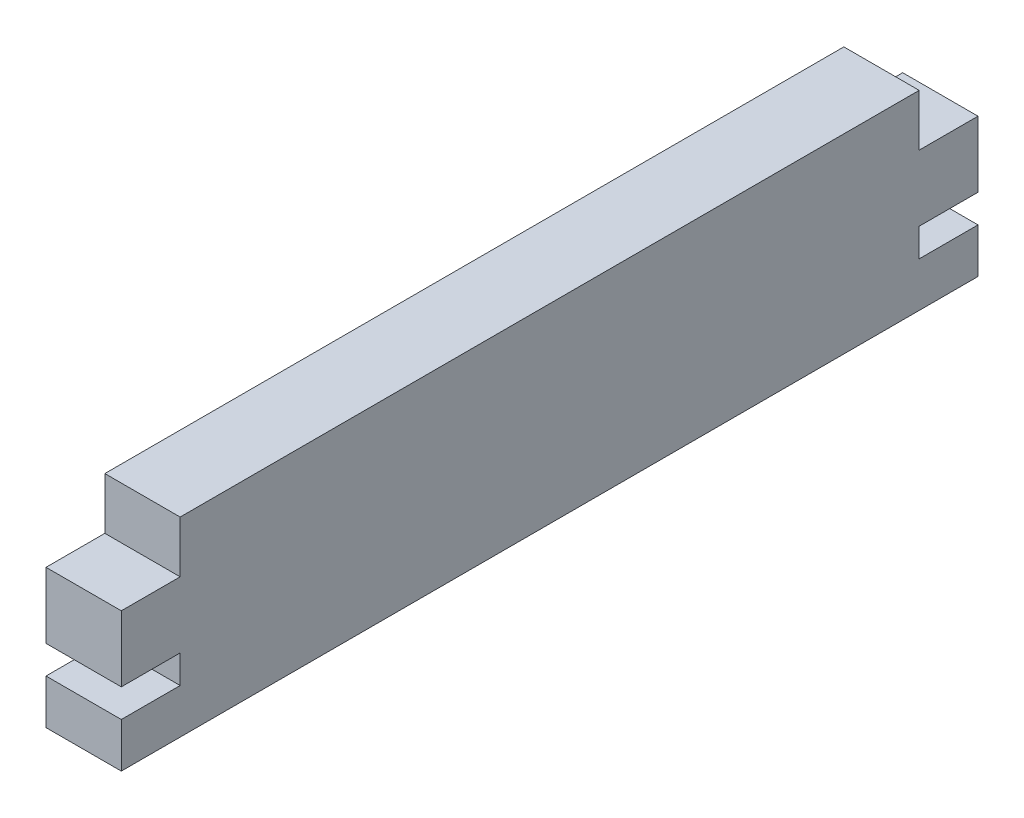
ISO-10303-21;
HEADER;
FILE_DESCRIPTION(('STEP AP214'),'2;1');
FILE_NAME('part.step','',(''),(''),'','','');
FILE_SCHEMA(('AUTOMOTIVE_DESIGN { 1 0 10303 214 1 1 1 1 }'));
ENDSEC;
DATA;
#1=APPLICATION_CONTEXT('core data for automotive mechanical design processes');
#2=APPLICATION_PROTOCOL_DEFINITION('international standard','automotive_design',2000,#1);
#3=PRODUCT_CONTEXT('',#1,'mechanical');
#4=PRODUCT('Part','Part','',(#3));
#5=PRODUCT_RELATED_PRODUCT_CATEGORY('part','',(#4));
#6=PRODUCT_DEFINITION_FORMATION('','',#4);
#7=PRODUCT_DEFINITION_CONTEXT('part definition',#1,'design');
#8=PRODUCT_DEFINITION('design','',#6,#7);
#9=PRODUCT_DEFINITION_SHAPE('','',#8);
#10=(LENGTH_UNIT() NAMED_UNIT(*) SI_UNIT(.MILLI.,.METRE.));
#11=(NAMED_UNIT(*) PLANE_ANGLE_UNIT() SI_UNIT($,.RADIAN.));
#12=(NAMED_UNIT(*) SI_UNIT($,.STERADIAN.) SOLID_ANGLE_UNIT());
#13=UNCERTAINTY_MEASURE_WITH_UNIT(LENGTH_MEASURE(1.E-05),#10,'distance_accuracy_value','');
#14=(GEOMETRIC_REPRESENTATION_CONTEXT(3) GLOBAL_UNCERTAINTY_ASSIGNED_CONTEXT((#13)) GLOBAL_UNIT_ASSIGNED_CONTEXT((#10,
#11,#12)) REPRESENTATION_CONTEXT('',''));
#15=CARTESIAN_POINT('',(0.,0.,0.));
#16=DIRECTION('',(0.,0.,1.));
#17=DIRECTION('',(1.,0.,0.));
#18=AXIS2_PLACEMENT_3D('',#15,#16,#17);
#19=CARTESIAN_POINT('',(4.064,10.287,0.));
#20=DIRECTION('',(0.,1.,0.));
#21=DIRECTION('',(0.,0.,1.));
#22=AXIS2_PLACEMENT_3D('',#19,#20,#21);
#23=PLANE('',#22);
#24=DIRECTION('',(0.,0.,-1.));
#25=VECTOR('',#24,1.);
#26=CARTESIAN_POINT('',(0.,10.287,0.));
#27=LINE('',#26,#25);
#28=CARTESIAN_POINT('',(0.,10.287,9.58569220054957));
#29=VERTEX_POINT('',#28);
#30=CARTESIAN_POINT('',(0.,10.287,-30.2923077994504));
#31=VERTEX_POINT('',#30);
#32=EDGE_CURVE('E183',#29,#31,#27,.T.);
#33=ORIENTED_EDGE('',*,*,#32,.F.);
#34=DIRECTION('',(-1.,0.,0.));
#35=VECTOR('',#34,1.);
#36=CARTESIAN_POINT('',(4.064,10.287,9.58569220054957));
#37=LINE('',#36,#35);
#38=CARTESIAN_POINT('',(4.064,10.287,9.58569220054957));
#39=VERTEX_POINT('',#38);
#40=EDGE_CURVE('E11',#39,#29,#37,.T.);
#41=ORIENTED_EDGE('',*,*,#40,.F.);
#42=DIRECTION('',(0.,0.,-1.));
#43=VECTOR('',#42,1.);
#44=CARTESIAN_POINT('',(4.064,10.287,0.));
#45=LINE('',#44,#43);
#46=CARTESIAN_POINT('',(4.064,10.287,-30.2923077994504));
#47=VERTEX_POINT('',#46);
#48=EDGE_CURVE('E221',#39,#47,#45,.T.);
#49=ORIENTED_EDGE('',*,*,#48,.T.);
#50=DIRECTION('',(-1.,0.,0.));
#51=VECTOR('',#50,1.);
#52=CARTESIAN_POINT('',(4.064,10.287,-30.2923077994504));
#53=LINE('',#52,#51);
#54=EDGE_CURVE('E55',#47,#31,#53,.T.);
#55=ORIENTED_EDGE('',*,*,#54,.T.);
#56=EDGE_LOOP('',(#33,#41,#49,#55));
#57=FACE_BOUND('',#56,.T.);
#58=ADVANCED_FACE('F39',(#57),#23,.T.);
#59=CARTESIAN_POINT('',(4.064,0.,9.58569220054957));
#60=DIRECTION('',(0.,0.,-1.));
#61=DIRECTION('',(-1.,0.,0.));
#62=AXIS2_PLACEMENT_3D('',#59,#60,#61);
#63=PLANE('',#62);
#64=DIRECTION('',(0.,-1.,0.));
#65=VECTOR('',#64,1.);
#66=CARTESIAN_POINT('',(0.,0.,9.58569220054957));
#67=LINE('',#66,#65);
#68=CARTESIAN_POINT('',(0.,7.493,9.58569220054957));
#69=VERTEX_POINT('',#68);
#70=EDGE_CURVE('E185',#29,#69,#67,.T.);
#71=ORIENTED_EDGE('',*,*,#70,.T.);
#72=DIRECTION('',(-1.,0.,0.));
#73=VECTOR('',#72,1.);
#74=CARTESIAN_POINT('',(4.064,7.493,9.58569220054957));
#75=LINE('',#74,#73);
#76=CARTESIAN_POINT('',(4.064,7.493,9.58569220054957));
#77=VERTEX_POINT('',#76);
#78=EDGE_CURVE('E47',#77,#69,#75,.T.);
#79=ORIENTED_EDGE('',*,*,#78,.F.);
#80=DIRECTION('',(0.,-1.,0.));
#81=VECTOR('',#80,1.);
#82=CARTESIAN_POINT('',(4.064,0.,9.58569220054957));
#83=LINE('',#82,#81);
#84=EDGE_CURVE('E268',#39,#77,#83,.T.);
#85=ORIENTED_EDGE('',*,*,#84,.F.);
#86=ORIENTED_EDGE('',*,*,#40,.T.);
#87=EDGE_LOOP('',(#71,#79,#85,#86));
#88=FACE_BOUND('',#87,.T.);
#89=ADVANCED_FACE('F256',(#88),#63,.F.);
#90=CARTESIAN_POINT('',(4.064,7.49300000000001,0.));
#91=DIRECTION('',(0.,1.,0.));
#92=DIRECTION('',(0.,0.,1.));
#93=AXIS2_PLACEMENT_3D('',#90,#91,#92);
#94=PLANE('',#93);
#95=DIRECTION('',(0.,0.,-1.));
#96=VECTOR('',#95,1.);
#97=CARTESIAN_POINT('',(0.,7.49300000000001,0.));
#98=LINE('',#97,#96);
#99=CARTESIAN_POINT('',(0.,7.493,12.7606922005496));
#100=VERTEX_POINT('',#99);
#101=EDGE_CURVE('E188',#100,#69,#98,.T.);
#102=ORIENTED_EDGE('',*,*,#101,.F.);
#103=DIRECTION('',(-1.,0.,0.));
#104=VECTOR('',#103,1.);
#105=CARTESIAN_POINT('',(4.064,7.493,12.7606922005496));
#106=LINE('',#105,#104);
#107=CARTESIAN_POINT('',(4.064,7.493,12.7606922005496));
#108=VERTEX_POINT('',#107);
#109=EDGE_CURVE('E246',#108,#100,#106,.T.);
#110=ORIENTED_EDGE('',*,*,#109,.F.);
#111=DIRECTION('',(0.,0.,-1.));
#112=VECTOR('',#111,1.);
#113=CARTESIAN_POINT('',(4.064,7.49300000000001,0.));
#114=LINE('',#113,#112);
#115=EDGE_CURVE('E253',#108,#77,#114,.T.);
#116=ORIENTED_EDGE('',*,*,#115,.T.);
#117=ORIENTED_EDGE('',*,*,#78,.T.);
#118=EDGE_LOOP('',(#102,#110,#116,#117));
#119=FACE_BOUND('',#118,.T.);
#120=ADVANCED_FACE('F251',(#119),#94,.T.);
#121=CARTESIAN_POINT('',(4.064,0.,12.7606922005496));
#122=DIRECTION('',(0.,0.,1.));
#123=DIRECTION('',(1.,0.,0.));
#124=AXIS2_PLACEMENT_3D('',#121,#122,#123);
#125=PLANE('',#124);
#126=DIRECTION('',(0.,1.,0.));
#127=VECTOR('',#126,1.);
#128=CARTESIAN_POINT('',(0.,0.,12.7606922005496));
#129=LINE('',#128,#127);
#130=CARTESIAN_POINT('',(0.,3.937,12.7606922005496));
#131=VERTEX_POINT('',#130);
#132=EDGE_CURVE('E191',#131,#100,#129,.T.);
#133=ORIENTED_EDGE('',*,*,#132,.F.);
#134=DIRECTION('',(-1.,0.,0.));
#135=VECTOR('',#134,1.);
#136=CARTESIAN_POINT('',(4.064,3.937,12.7606922005496));
#137=LINE('',#136,#135);
#138=CARTESIAN_POINT('',(4.064,3.937,12.7606922005496));
#139=VERTEX_POINT('',#138);
#140=EDGE_CURVE('E244',#139,#131,#137,.T.);
#141=ORIENTED_EDGE('',*,*,#140,.F.);
#142=DIRECTION('',(0.,1.,0.));
#143=VECTOR('',#142,1.);
#144=CARTESIAN_POINT('',(4.064,0.,12.7606922005496));
#145=LINE('',#144,#143);
#146=EDGE_CURVE('E267',#139,#108,#145,.T.);
#147=ORIENTED_EDGE('',*,*,#146,.T.);
#148=ORIENTED_EDGE('',*,*,#109,.T.);
#149=EDGE_LOOP('',(#133,#141,#147,#148));
#150=FACE_BOUND('',#149,.T.);
#151=ADVANCED_FACE('F263',(#150),#125,.T.);
#152=CARTESIAN_POINT('',(4.064,3.937,0.));
#153=DIRECTION('',(0.,1.,0.));
#154=DIRECTION('',(0.,0.,1.));
#155=AXIS2_PLACEMENT_3D('',#152,#153,#154);
#156=PLANE('',#155);
#157=DIRECTION('',(0.,0.,-1.));
#158=VECTOR('',#157,1.);
#159=CARTESIAN_POINT('',(0.,3.937,0.));
#160=LINE('',#159,#158);
#161=CARTESIAN_POINT('',(0.,3.937,9.58569220054957));
#162=VERTEX_POINT('',#161);
#163=EDGE_CURVE('E194',#131,#162,#160,.T.);
#164=ORIENTED_EDGE('',*,*,#163,.T.);
#165=DIRECTION('',(-1.,0.,0.));
#166=VECTOR('',#165,1.);
#167=CARTESIAN_POINT('',(4.064,3.937,9.58569220054957));
#168=LINE('',#167,#166);
#169=CARTESIAN_POINT('',(4.064,3.937,9.58569220054957));
#170=VERTEX_POINT('',#169);
#171=EDGE_CURVE('E241',#170,#162,#168,.T.);
#172=ORIENTED_EDGE('',*,*,#171,.F.);
#173=DIRECTION('',(0.,0.,-1.));
#174=VECTOR('',#173,1.);
#175=CARTESIAN_POINT('',(4.064,3.937,0.));
#176=LINE('',#175,#174);
#177=EDGE_CURVE('E270',#139,#170,#176,.T.);
#178=ORIENTED_EDGE('',*,*,#177,.F.);
#179=ORIENTED_EDGE('',*,*,#140,.T.);
#180=EDGE_LOOP('',(#164,#172,#178,#179));
#181=FACE_BOUND('',#180,.T.);
#182=ADVANCED_FACE('F311',(#181),#156,.F.);
#183=CARTESIAN_POINT('',(4.064,0.,9.58569220054957));
#184=DIRECTION('',(0.,0.,-1.));
#185=DIRECTION('',(-1.,0.,0.));
#186=AXIS2_PLACEMENT_3D('',#183,#184,#185);
#187=PLANE('',#186);
#188=DIRECTION('',(0.,-1.,0.));
#189=VECTOR('',#188,1.);
#190=CARTESIAN_POINT('',(0.,0.,9.58569220054957));
#191=LINE('',#190,#189);
#192=CARTESIAN_POINT('',(0.,2.413,9.58569220054957));
#193=VERTEX_POINT('',#192);
#194=EDGE_CURVE('E197',#162,#193,#191,.T.);
#195=ORIENTED_EDGE('',*,*,#194,.T.);
#196=DIRECTION('',(-1.,0.,0.));
#197=VECTOR('',#196,1.);
#198=CARTESIAN_POINT('',(4.064,2.413,9.58569220054957));
#199=LINE('',#198,#197);
#200=CARTESIAN_POINT('',(4.064,2.413,9.58569220054957));
#201=VERTEX_POINT('',#200);
#202=EDGE_CURVE('E239',#201,#193,#199,.T.);
#203=ORIENTED_EDGE('',*,*,#202,.F.);
#204=DIRECTION('',(0.,-1.,0.));
#205=VECTOR('',#204,1.);
#206=CARTESIAN_POINT('',(4.064,0.,9.58569220054957));
#207=LINE('',#206,#205);
#208=EDGE_CURVE('E277',#170,#201,#207,.T.);
#209=ORIENTED_EDGE('',*,*,#208,.F.);
#210=ORIENTED_EDGE('',*,*,#171,.T.);
#211=EDGE_LOOP('',(#195,#203,#209,#210));
#212=FACE_BOUND('',#211,.T.);
#213=ADVANCED_FACE('F314',(#212),#187,.F.);
#214=CARTESIAN_POINT('',(4.064,2.413,0.));
#215=DIRECTION('',(0.,1.,0.));
#216=DIRECTION('',(0.,0.,1.));
#217=AXIS2_PLACEMENT_3D('',#214,#215,#216);
#218=PLANE('',#217);
#219=DIRECTION('',(0.,0.,-1.));
#220=VECTOR('',#219,1.);
#221=CARTESIAN_POINT('',(0.,2.413,0.));
#222=LINE('',#221,#220);
#223=CARTESIAN_POINT('',(0.,2.413,12.7606922005496));
#224=VERTEX_POINT('',#223);
#225=EDGE_CURVE('E200',#224,#193,#222,.T.);
#226=ORIENTED_EDGE('',*,*,#225,.F.);
#227=DIRECTION('',(-1.,0.,0.));
#228=VECTOR('',#227,1.);
#229=CARTESIAN_POINT('',(4.064,2.413,12.7606922005496));
#230=LINE('',#229,#228);
#231=CARTESIAN_POINT('',(4.064,2.413,12.7606922005496));
#232=VERTEX_POINT('',#231);
#233=EDGE_CURVE('E237',#232,#224,#230,.T.);
#234=ORIENTED_EDGE('',*,*,#233,.F.);
#235=DIRECTION('',(0.,0.,-1.));
#236=VECTOR('',#235,1.);
#237=CARTESIAN_POINT('',(4.064,2.413,0.));
#238=LINE('',#237,#236);
#239=EDGE_CURVE('E279',#232,#201,#238,.T.);
#240=ORIENTED_EDGE('',*,*,#239,.T.);
#241=ORIENTED_EDGE('',*,*,#202,.T.);
#242=EDGE_LOOP('',(#226,#234,#240,#241));
#243=FACE_BOUND('',#242,.T.);
#244=ADVANCED_FACE('F318',(#243),#218,.T.);
#245=CARTESIAN_POINT('',(0.,0.,12.7606922005496));
#246=VERTEX_POINT('',#245);
#247=EDGE_CURVE('E195',#246,#224,#129,.T.);
#248=ORIENTED_EDGE('',*,*,#247,.F.);
#249=DIRECTION('',(-1.,0.,0.));
#250=VECTOR('',#249,1.);
#251=CARTESIAN_POINT('',(4.064,0.,12.7606922005496));
#252=LINE('',#251,#250);
#253=CARTESIAN_POINT('',(4.064,0.,12.7606922005496));
#254=VERTEX_POINT('',#253);
#255=EDGE_CURVE('E235',#254,#246,#252,.T.);
#256=ORIENTED_EDGE('',*,*,#255,.F.);
#257=EDGE_CURVE('E272',#254,#232,#145,.T.);
#258=ORIENTED_EDGE('',*,*,#257,.T.);
#259=ORIENTED_EDGE('',*,*,#233,.T.);
#260=EDGE_LOOP('',(#248,#256,#258,#259));
#261=FACE_BOUND('',#260,.T.);
#262=ADVANCED_FACE('F322',(#261),#125,.T.);
#263=CARTESIAN_POINT('',(4.064,0.,0.));
#264=DIRECTION('',(0.,1.,0.));
#265=DIRECTION('',(0.,0.,1.));
#266=AXIS2_PLACEMENT_3D('',#263,#264,#265);
#267=PLANE('',#266);
#268=DIRECTION('',(0.,0.,-1.));
#269=VECTOR('',#268,1.);
#270=CARTESIAN_POINT('',(0.,0.,0.));
#271=LINE('',#270,#269);
#272=CARTESIAN_POINT('',(0.,0.,-33.4673077994504));
#273=VERTEX_POINT('',#272);
#274=EDGE_CURVE('E203',#246,#273,#271,.T.);
#275=ORIENTED_EDGE('',*,*,#274,.T.);
#276=DIRECTION('',(-1.,0.,0.));
#277=VECTOR('',#276,1.);
#278=CARTESIAN_POINT('',(4.064,0.,-33.4673077994504));
#279=LINE('',#278,#277);
#280=CARTESIAN_POINT('',(4.064,0.,-33.4673077994504));
#281=VERTEX_POINT('',#280);
#282=EDGE_CURVE('E232',#281,#273,#279,.T.);
#283=ORIENTED_EDGE('',*,*,#282,.F.);
#284=DIRECTION('',(0.,0.,-1.));
#285=VECTOR('',#284,1.);
#286=CARTESIAN_POINT('',(4.064,0.,0.));
#287=LINE('',#286,#285);
#288=EDGE_CURVE('E282',#254,#281,#287,.T.);
#289=ORIENTED_EDGE('',*,*,#288,.F.);
#290=ORIENTED_EDGE('',*,*,#255,.T.);
#291=EDGE_LOOP('',(#275,#283,#289,#290));
#292=FACE_BOUND('',#291,.T.);
#293=ADVANCED_FACE('F326',(#292),#267,.F.);
#294=CARTESIAN_POINT('',(4.064,0.,-33.4673077994504));
#295=DIRECTION('',(0.,0.,1.));
#296=DIRECTION('',(1.,0.,0.));
#297=AXIS2_PLACEMENT_3D('',#294,#295,#296);
#298=PLANE('',#297);
#299=DIRECTION('',(0.,1.,0.));
#300=VECTOR('',#299,1.);
#301=CARTESIAN_POINT('',(0.,0.,-33.4673077994504));
#302=LINE('',#301,#300);
#303=CARTESIAN_POINT('',(0.,2.413,-33.4673077994504));
#304=VERTEX_POINT('',#303);
#305=EDGE_CURVE('E205',#273,#304,#302,.T.);
#306=ORIENTED_EDGE('',*,*,#305,.T.);
#307=DIRECTION('',(-1.,0.,0.));
#308=VECTOR('',#307,1.);
#309=CARTESIAN_POINT('',(4.064,2.413,-33.4673077994504));
#310=LINE('',#309,#308);
#311=CARTESIAN_POINT('',(4.064,2.413,-33.4673077994504));
#312=VERTEX_POINT('',#311);
#313=EDGE_CURVE('E229',#312,#304,#310,.T.);
#314=ORIENTED_EDGE('',*,*,#313,.F.);
#315=DIRECTION('',(0.,1.,0.));
#316=VECTOR('',#315,1.);
#317=CARTESIAN_POINT('',(4.064,0.,-33.4673077994504));
#318=LINE('',#317,#316);
#319=EDGE_CURVE('E166',#281,#312,#318,.T.);
#320=ORIENTED_EDGE('',*,*,#319,.F.);
#321=ORIENTED_EDGE('',*,*,#282,.T.);
#322=EDGE_LOOP('',(#306,#314,#320,#321));
#323=FACE_BOUND('',#322,.T.);
#324=ADVANCED_FACE('F330',(#323),#298,.F.);
#325=CARTESIAN_POINT('',(4.064,2.413,0.));
#326=DIRECTION('',(0.,-1.,0.));
#327=DIRECTION('',(0.,0.,-1.));
#328=AXIS2_PLACEMENT_3D('',#325,#326,#327);
#329=PLANE('',#328);
#330=DIRECTION('',(0.,0.,1.));
#331=VECTOR('',#330,1.);
#332=CARTESIAN_POINT('',(0.,2.413,0.));
#333=LINE('',#332,#331);
#334=CARTESIAN_POINT('',(0.,2.413,-30.2923077994504));
#335=VERTEX_POINT('',#334);
#336=EDGE_CURVE('E207',#304,#335,#333,.T.);
#337=ORIENTED_EDGE('',*,*,#336,.T.);
#338=DIRECTION('',(-1.,0.,0.));
#339=VECTOR('',#338,1.);
#340=CARTESIAN_POINT('',(4.064,2.413,-30.2923077994504));
#341=LINE('',#340,#339);
#342=CARTESIAN_POINT('',(4.064,2.413,-30.2923077994504));
#343=VERTEX_POINT('',#342);
#344=EDGE_CURVE('E227',#343,#335,#341,.T.);
#345=ORIENTED_EDGE('',*,*,#344,.F.);
#346=DIRECTION('',(0.,0.,1.));
#347=VECTOR('',#346,1.);
#348=CARTESIAN_POINT('',(4.064,2.413,0.));
#349=LINE('',#348,#347);
#350=EDGE_CURVE('E284',#312,#343,#349,.T.);
#351=ORIENTED_EDGE('',*,*,#350,.F.);
#352=ORIENTED_EDGE('',*,*,#313,.T.);
#353=EDGE_LOOP('',(#337,#345,#351,#352));
#354=FACE_BOUND('',#353,.T.);
#355=ADVANCED_FACE('F332',(#354),#329,.F.);
#356=CARTESIAN_POINT('',(4.064,0.,-30.2923077994504));
#357=DIRECTION('',(0.,0.,-1.));
#358=DIRECTION('',(-1.,0.,0.));
#359=AXIS2_PLACEMENT_3D('',#356,#357,#358);
#360=PLANE('',#359);
#361=DIRECTION('',(0.,-1.,0.));
#362=VECTOR('',#361,1.);
#363=CARTESIAN_POINT('',(0.,0.,-30.2923077994504));
#364=LINE('',#363,#362);
#365=CARTESIAN_POINT('',(0.,3.937,-30.2923077994504));
#366=VERTEX_POINT('',#365);
#367=EDGE_CURVE('E210',#366,#335,#364,.T.);
#368=ORIENTED_EDGE('',*,*,#367,.F.);
#369=DIRECTION('',(-1.,0.,0.));
#370=VECTOR('',#369,1.);
#371=CARTESIAN_POINT('',(4.064,3.937,-30.2923077994504));
#372=LINE('',#371,#370);
#373=CARTESIAN_POINT('',(4.064,3.937,-30.2923077994504));
#374=VERTEX_POINT('',#373);
#375=EDGE_CURVE('E225',#374,#366,#372,.T.);
#376=ORIENTED_EDGE('',*,*,#375,.F.);
#377=DIRECTION('',(0.,-1.,0.));
#378=VECTOR('',#377,1.);
#379=CARTESIAN_POINT('',(4.064,0.,-30.2923077994504));
#380=LINE('',#379,#378);
#381=EDGE_CURVE('E285',#374,#343,#380,.T.);
#382=ORIENTED_EDGE('',*,*,#381,.T.);
#383=ORIENTED_EDGE('',*,*,#344,.T.);
#384=EDGE_LOOP('',(#368,#376,#382,#383));
#385=FACE_BOUND('',#384,.T.);
#386=ADVANCED_FACE('F335',(#385),#360,.T.);
#387=CARTESIAN_POINT('',(4.064,3.93699999999999,0.));
#388=DIRECTION('',(0.,-1.,0.));
#389=DIRECTION('',(0.,0.,-1.));
#390=AXIS2_PLACEMENT_3D('',#387,#388,#389);
#391=PLANE('',#390);
#392=DIRECTION('',(0.,0.,1.));
#393=VECTOR('',#392,1.);
#394=CARTESIAN_POINT('',(0.,3.93699999999999,0.));
#395=LINE('',#394,#393);
#396=CARTESIAN_POINT('',(0.,3.937,-33.4673077994504));
#397=VERTEX_POINT('',#396);
#398=EDGE_CURVE('E213',#397,#366,#395,.T.);
#399=ORIENTED_EDGE('',*,*,#398,.F.);
#400=DIRECTION('',(-1.,0.,0.));
#401=VECTOR('',#400,1.);
#402=CARTESIAN_POINT('',(4.064,3.937,-33.4673077994504));
#403=LINE('',#402,#401);
#404=CARTESIAN_POINT('',(4.064,3.937,-33.4673077994504));
#405=VERTEX_POINT('',#404);
#406=EDGE_CURVE('E174',#405,#397,#403,.T.);
#407=ORIENTED_EDGE('',*,*,#406,.F.);
#408=DIRECTION('',(0.,0.,1.));
#409=VECTOR('',#408,1.);
#410=CARTESIAN_POINT('',(4.064,3.93699999999999,0.));
#411=LINE('',#410,#409);
#412=EDGE_CURVE('E163',#405,#374,#411,.T.);
#413=ORIENTED_EDGE('',*,*,#412,.T.);
#414=ORIENTED_EDGE('',*,*,#375,.T.);
#415=EDGE_LOOP('',(#399,#407,#413,#414));
#416=FACE_BOUND('',#415,.T.);
#417=ADVANCED_FACE('F290',(#416),#391,.T.);
#418=CARTESIAN_POINT('',(0.,7.493,-33.4673077994504));
#419=VERTEX_POINT('',#418);
#420=EDGE_CURVE('E171',#397,#419,#302,.T.);
#421=ORIENTED_EDGE('',*,*,#420,.T.);
#422=DIRECTION('',(-1.,0.,0.));
#423=VECTOR('',#422,1.);
#424=CARTESIAN_POINT('',(4.064,7.493,-33.4673077994504));
#425=LINE('',#424,#423);
#426=CARTESIAN_POINT('',(4.064,7.493,-33.4673077994504));
#427=VERTEX_POINT('',#426);
#428=EDGE_CURVE('E168',#427,#419,#425,.T.);
#429=ORIENTED_EDGE('',*,*,#428,.F.);
#430=EDGE_CURVE('E154',#405,#427,#318,.T.);
#431=ORIENTED_EDGE('',*,*,#430,.F.);
#432=ORIENTED_EDGE('',*,*,#406,.T.);
#433=EDGE_LOOP('',(#421,#429,#431,#432));
#434=FACE_BOUND('',#433,.T.);
#435=ADVANCED_FACE('F169',(#434),#298,.F.);
#436=CARTESIAN_POINT('',(4.064,7.49300000000004,0.));
#437=DIRECTION('',(0.,-1.,0.));
#438=DIRECTION('',(0.,0.,-1.));
#439=AXIS2_PLACEMENT_3D('',#436,#437,#438);
#440=PLANE('',#439);
#441=DIRECTION('',(0.,0.,1.));
#442=VECTOR('',#441,1.);
#443=CARTESIAN_POINT('',(0.,7.49300000000004,0.));
#444=LINE('',#443,#442);
#445=CARTESIAN_POINT('',(0.,7.493,-30.2923077994504));
#446=VERTEX_POINT('',#445);
#447=EDGE_CURVE('E216',#419,#446,#444,.T.);
#448=ORIENTED_EDGE('',*,*,#447,.T.);
#449=DIRECTION('',(-1.,0.,0.));
#450=VECTOR('',#449,1.);
#451=CARTESIAN_POINT('',(4.064,7.493,-30.2923077994504));
#452=LINE('',#451,#450);
#453=CARTESIAN_POINT('',(4.064,7.493,-30.2923077994504));
#454=VERTEX_POINT('',#453);
#455=EDGE_CURVE('E105',#454,#446,#452,.T.);
#456=ORIENTED_EDGE('',*,*,#455,.F.);
#457=DIRECTION('',(0.,0.,1.));
#458=VECTOR('',#457,1.);
#459=CARTESIAN_POINT('',(4.064,7.49300000000004,0.));
#460=LINE('',#459,#458);
#461=EDGE_CURVE('E160',#427,#454,#460,.T.);
#462=ORIENTED_EDGE('',*,*,#461,.F.);
#463=ORIENTED_EDGE('',*,*,#428,.T.);
#464=EDGE_LOOP('',(#448,#456,#462,#463));
#465=FACE_BOUND('',#464,.T.);
#466=ADVANCED_FACE('F176',(#465),#440,.F.);
#467=CARTESIAN_POINT('',(4.064,0.,-30.2923077994504));
#468=DIRECTION('',(0.,0.,-1.));
#469=DIRECTION('',(-1.,0.,0.));
#470=AXIS2_PLACEMENT_3D('',#467,#468,#469);
#471=PLANE('',#470);
#472=DIRECTION('',(0.,-1.,0.));
#473=VECTOR('',#472,1.);
#474=CARTESIAN_POINT('',(0.,0.,-30.2923077994504));
#475=LINE('',#474,#473);
#476=EDGE_CURVE('E218',#31,#446,#475,.T.);
#477=ORIENTED_EDGE('',*,*,#476,.F.);
#478=ORIENTED_EDGE('',*,*,#54,.F.);
#479=DIRECTION('',(0.,-1.,0.));
#480=VECTOR('',#479,1.);
#481=CARTESIAN_POINT('',(4.064,0.,-30.2923077994504));
#482=LINE('',#481,#480);
#483=EDGE_CURVE('E177',#47,#454,#482,.T.);
#484=ORIENTED_EDGE('',*,*,#483,.T.);
#485=ORIENTED_EDGE('',*,*,#455,.T.);
#486=EDGE_LOOP('',(#477,#478,#484,#485));
#487=FACE_BOUND('',#486,.T.);
#488=ADVANCED_FACE('F292',(#487),#471,.T.);
#489=CARTESIAN_POINT('',(4.064,0.,0.));
#490=DIRECTION('',(1.,0.,0.));
#491=DIRECTION('',(0.,0.,-1.));
#492=AXIS2_PLACEMENT_3D('',#489,#490,#491);
#493=PLANE('',#492);
#494=ORIENTED_EDGE('',*,*,#48,.F.);
#495=ORIENTED_EDGE('',*,*,#84,.T.);
#496=ORIENTED_EDGE('',*,*,#115,.F.);
#497=ORIENTED_EDGE('',*,*,#146,.F.);
#498=ORIENTED_EDGE('',*,*,#177,.T.);
#499=ORIENTED_EDGE('',*,*,#208,.T.);
#500=ORIENTED_EDGE('',*,*,#239,.F.);
#501=ORIENTED_EDGE('',*,*,#257,.F.);
#502=ORIENTED_EDGE('',*,*,#288,.T.);
#503=ORIENTED_EDGE('',*,*,#319,.T.);
#504=ORIENTED_EDGE('',*,*,#350,.T.);
#505=ORIENTED_EDGE('',*,*,#381,.F.);
#506=ORIENTED_EDGE('',*,*,#412,.F.);
#507=ORIENTED_EDGE('',*,*,#430,.T.);
#508=ORIENTED_EDGE('',*,*,#461,.T.);
#509=ORIENTED_EDGE('',*,*,#483,.F.);
#510=EDGE_LOOP('',(#494,#495,#496,#497,#498,#499,#500,#501,#502,#503,#504,#505,#506,#507,#508,#509));
#511=FACE_BOUND('',#510,.T.);
#512=ADVANCED_FACE('F157',(#511),#493,.T.);
#513=CARTESIAN_POINT('',(0.,0.,0.));
#514=DIRECTION('',(1.,0.,0.));
#515=DIRECTION('',(0.,0.,-1.));
#516=AXIS2_PLACEMENT_3D('',#513,#514,#515);
#517=PLANE('',#516);
#518=ORIENTED_EDGE('',*,*,#32,.T.);
#519=ORIENTED_EDGE('',*,*,#476,.T.);
#520=ORIENTED_EDGE('',*,*,#447,.F.);
#521=ORIENTED_EDGE('',*,*,#420,.F.);
#522=ORIENTED_EDGE('',*,*,#398,.T.);
#523=ORIENTED_EDGE('',*,*,#367,.T.);
#524=ORIENTED_EDGE('',*,*,#336,.F.);
#525=ORIENTED_EDGE('',*,*,#305,.F.);
#526=ORIENTED_EDGE('',*,*,#274,.F.);
#527=ORIENTED_EDGE('',*,*,#247,.T.);
#528=ORIENTED_EDGE('',*,*,#225,.T.);
#529=ORIENTED_EDGE('',*,*,#194,.F.);
#530=ORIENTED_EDGE('',*,*,#163,.F.);
#531=ORIENTED_EDGE('',*,*,#132,.T.);
#532=ORIENTED_EDGE('',*,*,#101,.T.);
#533=ORIENTED_EDGE('',*,*,#70,.F.);
#534=EDGE_LOOP('',(#518,#519,#520,#521,#522,#523,#524,#525,#526,#527,#528,#529,#530,#531,#532,#533));
#535=FACE_BOUND('',#534,.T.);
#536=ADVANCED_FACE('F258',(#535),#517,.F.);
#537=CLOSED_SHELL('',(#58,#89,#120,#151,#182,#213,#244,#262,#293,#324,#355,#386,#417,#435,#466,
#488,#512,#536));
#538=MANIFOLD_SOLID_BREP('B2',#537);
#539=ADVANCED_BREP_SHAPE_REPRESENTATION('',(#18,#538),#14);
#540=SHAPE_DEFINITION_REPRESENTATION(#9,#539);
ENDSEC;
END-ISO-10303-21;
